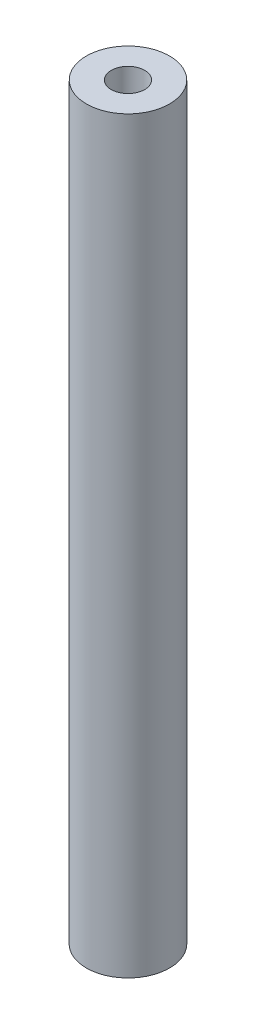
ISO-10303-21;
HEADER;
FILE_DESCRIPTION(('STEP AP214'),'2;1');
FILE_NAME('part.step','',(''),(''),'','','');
FILE_SCHEMA(('AUTOMOTIVE_DESIGN { 1 0 10303 214 1 1 1 1 }'));
ENDSEC;
DATA;
#1=APPLICATION_CONTEXT('core data for automotive mechanical design processes');
#2=APPLICATION_PROTOCOL_DEFINITION('international standard','automotive_design',2000,#1);
#3=PRODUCT_CONTEXT('',#1,'mechanical');
#4=PRODUCT('Part','Part','',(#3));
#5=PRODUCT_RELATED_PRODUCT_CATEGORY('part','',(#4));
#6=PRODUCT_DEFINITION_FORMATION('','',#4);
#7=PRODUCT_DEFINITION_CONTEXT('part definition',#1,'design');
#8=PRODUCT_DEFINITION('design','',#6,#7);
#9=PRODUCT_DEFINITION_SHAPE('','',#8);
#10=(LENGTH_UNIT() NAMED_UNIT(*) SI_UNIT(.MILLI.,.METRE.));
#11=(NAMED_UNIT(*) PLANE_ANGLE_UNIT() SI_UNIT($,.RADIAN.));
#12=(NAMED_UNIT(*) SI_UNIT($,.STERADIAN.) SOLID_ANGLE_UNIT());
#13=UNCERTAINTY_MEASURE_WITH_UNIT(LENGTH_MEASURE(1.E-05),#10,'distance_accuracy_value','');
#14=(GEOMETRIC_REPRESENTATION_CONTEXT(3) GLOBAL_UNCERTAINTY_ASSIGNED_CONTEXT((#13)) GLOBAL_UNIT_ASSIGNED_CONTEXT((#10,
#11,#12)) REPRESENTATION_CONTEXT('',''));
#15=CARTESIAN_POINT('',(0.,0.,0.));
#16=DIRECTION('',(0.,0.,1.));
#17=DIRECTION('',(1.,0.,0.));
#18=AXIS2_PLACEMENT_3D('',#15,#16,#17);
#19=CARTESIAN_POINT('',(0.,114.3,0.));
#20=DIRECTION('',(0.,-1.,0.));
#21=DIRECTION('',(0.,0.,-1.));
#22=AXIS2_PLACEMENT_3D('',#19,#20,#21);
#23=CYLINDRICAL_SURFACE('',#22,6.35);
#24=CARTESIAN_POINT('',(0.,114.3,0.));
#25=DIRECTION('',(0.,1.,0.));
#26=DIRECTION('',(0.,0.,1.));
#27=AXIS2_PLACEMENT_3D('',#24,#25,#26);
#28=CIRCLE('',#27,6.35);
#29=CARTESIAN_POINT('',(0.,114.3,6.35));
#30=VERTEX_POINT('',#29);
#31=EDGE_CURVE('E11',#30,#30,#28,.T.);
#32=ORIENTED_EDGE('',*,*,#31,.F.);
#33=EDGE_LOOP('',(#32));
#34=FACE_BOUND('',#33,.T.);
#35=CARTESIAN_POINT('',(0.,0.,0.));
#36=DIRECTION('',(0.,1.,0.));
#37=DIRECTION('',(0.,0.,1.));
#38=AXIS2_PLACEMENT_3D('',#35,#36,#37);
#39=CIRCLE('',#38,6.35);
#40=CARTESIAN_POINT('',(0.,0.,6.35));
#41=VERTEX_POINT('',#40);
#42=EDGE_CURVE('E41',#41,#41,#39,.T.);
#43=ORIENTED_EDGE('',*,*,#42,.T.);
#44=EDGE_LOOP('',(#43));
#45=FACE_BOUND('',#44,.T.);
#46=ADVANCED_FACE('F38',(#34,#45),#23,.T.);
#47=CARTESIAN_POINT('',(0.,114.3,0.));
#48=DIRECTION('',(0.,1.,0.));
#49=DIRECTION('',(0.,0.,1.));
#50=AXIS2_PLACEMENT_3D('',#47,#48,#49);
#51=PLANE('',#50);
#52=CARTESIAN_POINT('',(0.,114.3,0.));
#53=DIRECTION('',(0.,1.,0.));
#54=DIRECTION('',(0.,0.,1.));
#55=AXIS2_PLACEMENT_3D('',#52,#53,#54);
#56=CIRCLE('',#55,2.55269999999999);
#57=CARTESIAN_POINT('',(0.,114.3,2.55269999999999));
#58=VERTEX_POINT('',#57);
#59=EDGE_CURVE('E57',#58,#58,#56,.T.);
#60=ORIENTED_EDGE('',*,*,#59,.F.);
#61=EDGE_LOOP('',(#60));
#62=FACE_BOUND('',#61,.T.);
#63=ORIENTED_EDGE('',*,*,#31,.T.);
#64=EDGE_LOOP('',(#63));
#65=FACE_BOUND('',#64,.T.);
#66=ADVANCED_FACE('F65',(#62,#65),#51,.T.);
#67=CARTESIAN_POINT('',(0.,0.,0.));
#68=DIRECTION('',(0.,1.,0.));
#69=DIRECTION('',(0.,0.,1.));
#70=AXIS2_PLACEMENT_3D('',#67,#68,#69);
#71=PLANE('',#70);
#72=ORIENTED_EDGE('',*,*,#42,.F.);
#73=EDGE_LOOP('',(#72));
#74=FACE_BOUND('',#73,.T.);
#75=ADVANCED_FACE('F51',(#74),#71,.F.);
#76=CARTESIAN_POINT('',(0.,97.79,0.));
#77=DIRECTION('',(0.,1.,0.));
#78=DIRECTION('',(0.,0.,1.));
#79=AXIS2_PLACEMENT_3D('',#76,#77,#78);
#80=CONICAL_SURFACE('',#79,2.55269999999999,1.02974425867665);
#81=CARTESIAN_POINT('',(0.,96.2561830978084,0.));
#82=VERTEX_POINT('',#81);
#83=VERTEX_LOOP('',#82);
#84=FACE_BOUND('',#83,.T.);
#85=CARTESIAN_POINT('',(0.,97.79,0.));
#86=DIRECTION('',(0.,1.,0.));
#87=DIRECTION('',(0.,0.,1.));
#88=AXIS2_PLACEMENT_3D('',#85,#86,#87);
#89=CIRCLE('',#88,2.55269999999999);
#90=CARTESIAN_POINT('',(0.,97.79,2.55269999999999));
#91=VERTEX_POINT('',#90);
#92=EDGE_CURVE('E55',#91,#91,#89,.T.);
#93=ORIENTED_EDGE('',*,*,#92,.T.);
#94=EDGE_LOOP('',(#93));
#95=FACE_BOUND('',#94,.T.);
#96=ADVANCED_FACE('F47',(#84,#95),#80,.F.);
#97=CARTESIAN_POINT('',(0.,114.3,0.));
#98=DIRECTION('',(0.,1.,0.));
#99=DIRECTION('',(0.,0.,1.));
#100=AXIS2_PLACEMENT_3D('',#97,#98,#99);
#101=CYLINDRICAL_SURFACE('',#100,2.55269999999999);
#102=ORIENTED_EDGE('',*,*,#92,.F.);
#103=EDGE_LOOP('',(#102));
#104=FACE_BOUND('',#103,.T.);
#105=ORIENTED_EDGE('',*,*,#59,.T.);
#106=EDGE_LOOP('',(#105));
#107=FACE_BOUND('',#106,.T.);
#108=ADVANCED_FACE('F50',(#104,#107),#101,.F.);
#109=CLOSED_SHELL('',(#46,#66,#75,#96,#108));
#110=MANIFOLD_SOLID_BREP('B2',#109);
#111=ADVANCED_BREP_SHAPE_REPRESENTATION('',(#18,#110),#14);
#112=SHAPE_DEFINITION_REPRESENTATION(#9,#111);
ENDSEC;
END-ISO-10303-21;
